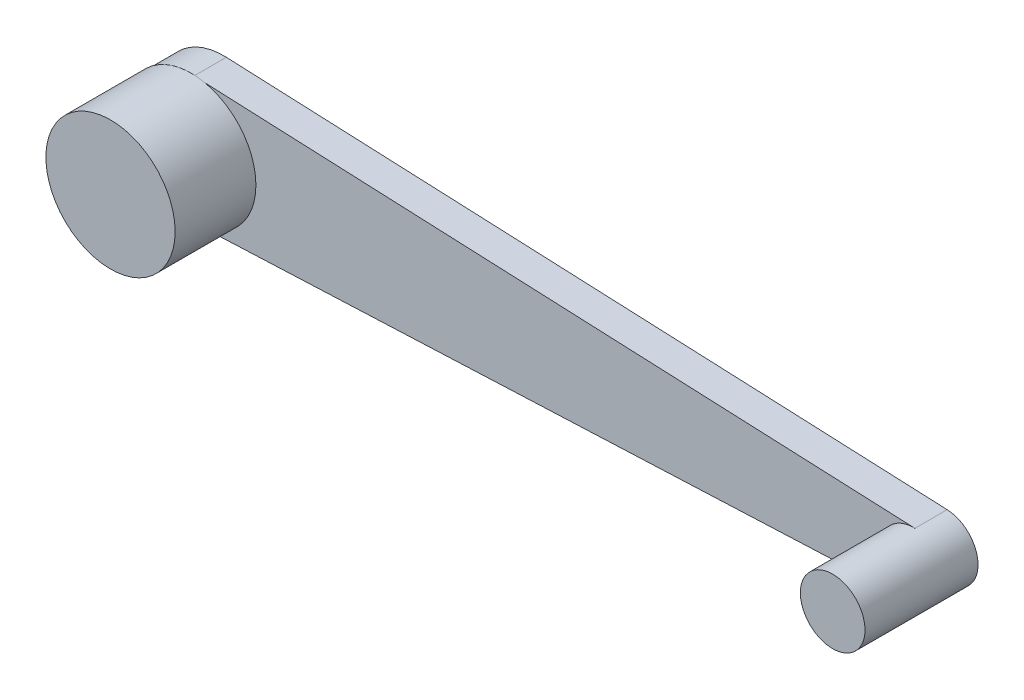
ISO-10303-21;
HEADER;
FILE_DESCRIPTION(('STEP AP214'),'2;1');
FILE_NAME('part.step','',(''),(''),'','','');
FILE_SCHEMA(('AUTOMOTIVE_DESIGN { 1 0 10303 214 1 1 1 1 }'));
ENDSEC;
DATA;
#1=APPLICATION_CONTEXT('core data for automotive mechanical design processes');
#2=APPLICATION_PROTOCOL_DEFINITION('international standard','automotive_design',2000,#1);
#3=PRODUCT_CONTEXT('',#1,'mechanical');
#4=PRODUCT('Part','Part','',(#3));
#5=PRODUCT_RELATED_PRODUCT_CATEGORY('part','',(#4));
#6=PRODUCT_DEFINITION_FORMATION('','',#4);
#7=PRODUCT_DEFINITION_CONTEXT('part definition',#1,'design');
#8=PRODUCT_DEFINITION('design','',#6,#7);
#9=PRODUCT_DEFINITION_SHAPE('','',#8);
#10=(LENGTH_UNIT() NAMED_UNIT(*) SI_UNIT(.MILLI.,.METRE.));
#11=(NAMED_UNIT(*) PLANE_ANGLE_UNIT() SI_UNIT($,.RADIAN.));
#12=(NAMED_UNIT(*) SI_UNIT($,.STERADIAN.) SOLID_ANGLE_UNIT());
#13=UNCERTAINTY_MEASURE_WITH_UNIT(LENGTH_MEASURE(1.E-05),#10,'distance_accuracy_value','');
#14=(GEOMETRIC_REPRESENTATION_CONTEXT(3) GLOBAL_UNCERTAINTY_ASSIGNED_CONTEXT((#13)) GLOBAL_UNIT_ASSIGNED_CONTEXT((#10,
#11,#12)) REPRESENTATION_CONTEXT('',''));
#15=CARTESIAN_POINT('',(0.,0.,0.));
#16=DIRECTION('',(0.,0.,1.));
#17=DIRECTION('',(1.,0.,0.));
#18=AXIS2_PLACEMENT_3D('',#15,#16,#17);
#19=CARTESIAN_POINT('',(0.,0.,2.));
#20=DIRECTION('',(0.,0.,1.));
#21=DIRECTION('',(1.,0.,0.));
#22=AXIS2_PLACEMENT_3D('',#19,#20,#21);
#23=PLANE('',#22);
#24=DIRECTION('',(0.999054373310961,0.0434782608695651,0.));
#25=VECTOR('',#24,1.);
#26=CARTESIAN_POINT('',(0.171455576559546,-3.93974920257844,2.));
#27=LINE('',#26,#25);
#28=CARTESIAN_POINT('',(0.840881057170086,-3.91061619795302,2.));
#29=VERTEX_POINT('',#28);
#30=CARTESIAN_POINT('',(44.7869565217391,-1.99810874662193,2.));
#31=VERTEX_POINT('',#30);
#32=EDGE_CURVE('E113',#29,#31,#27,.T.);
#33=ORIENTED_EDGE('',*,*,#32,.T.);
#34=CARTESIAN_POINT('',(44.7,0.,2.));
#35=DIRECTION('',(0.,0.,1.));
#36=DIRECTION('',(1.,0.,0.));
#37=AXIS2_PLACEMENT_3D('',#34,#35,#36);
#38=CIRCLE('',#37,2.);
#39=CARTESIAN_POINT('',(44.7869565217391,1.99810874662193,2.));
#40=VERTEX_POINT('',#39);
#41=EDGE_CURVE('E107',#40,#31,#38,.T.);
#42=ORIENTED_EDGE('',*,*,#41,.F.);
#43=DIRECTION('',(-0.999054373310961,0.0434782608695651,0.));
#44=VECTOR('',#43,1.);
#45=CARTESIAN_POINT('',(0.171455576559546,3.93974920257844,2.));
#46=LINE('',#45,#44);
#47=CARTESIAN_POINT('',(0.840881057170086,3.91061619795302,2.));
#48=VERTEX_POINT('',#47);
#49=EDGE_CURVE('E93',#40,#48,#46,.T.);
#50=ORIENTED_EDGE('',*,*,#49,.T.);
#51=CARTESIAN_POINT('',(0.,0.,2.));
#52=DIRECTION('',(0.,0.,1.));
#53=DIRECTION('',(1.,0.,0.));
#54=AXIS2_PLACEMENT_3D('',#51,#52,#53);
#55=CIRCLE('',#54,4.);
#56=EDGE_CURVE('E11',#29,#48,#55,.T.);
#57=ORIENTED_EDGE('',*,*,#56,.F.);
#58=EDGE_LOOP('',(#33,#42,#50,#57));
#59=FACE_BOUND('',#58,.T.);
#60=ADVANCED_FACE('F39',(#59),#23,.T.);
#61=CARTESIAN_POINT('',(0.,0.,2.));
#62=DIRECTION('',(0.,0.,-1.));
#63=DIRECTION('',(-1.,0.,0.));
#64=AXIS2_PLACEMENT_3D('',#61,#62,#63);
#65=CYLINDRICAL_SURFACE('',#64,3.94347826086956);
#66=CARTESIAN_POINT('',(0.,0.,0.));
#67=DIRECTION('',(0.,0.,1.));
#68=DIRECTION('',(1.,0.,0.));
#69=AXIS2_PLACEMENT_3D('',#66,#67,#68);
#70=CIRCLE('',#69,3.94347826086956);
#71=CARTESIAN_POINT('',(0.171455576559546,3.93974920257844,0.));
#72=VERTEX_POINT('',#71);
#73=CARTESIAN_POINT('',(0.171455576559546,-3.93974920257844,0.));
#74=VERTEX_POINT('',#73);
#75=EDGE_CURVE('E125',#72,#74,#70,.T.);
#76=ORIENTED_EDGE('',*,*,#75,.T.);
#77=DIRECTION('',(0.,0.,-1.));
#78=VECTOR('',#77,1.);
#79=CARTESIAN_POINT('',(0.171455576559546,-3.93974920257844,2.));
#80=LINE('',#79,#78);
#81=CARTESIAN_POINT('',(0.171455576559546,-3.93974920257844,2.));
#82=VERTEX_POINT('',#81);
#83=EDGE_CURVE('E43',#82,#74,#80,.T.);
#84=ORIENTED_EDGE('',*,*,#83,.F.);
#85=CARTESIAN_POINT('',(0.,0.,2.));
#86=DIRECTION('',(0.,0.,1.));
#87=DIRECTION('',(1.,0.,0.));
#88=AXIS2_PLACEMENT_3D('',#85,#86,#87);
#89=CIRCLE('',#88,3.94347826086956);
#90=CARTESIAN_POINT('',(0.171455576559546,3.93974920257844,2.));
#91=VERTEX_POINT('',#90);
#92=EDGE_CURVE('E129',#91,#82,#89,.T.);
#93=ORIENTED_EDGE('',*,*,#92,.F.);
#94=DIRECTION('',(0.,0.,-1.));
#95=VECTOR('',#94,1.);
#96=CARTESIAN_POINT('',(0.171455576559546,3.93974920257844,2.));
#97=LINE('',#96,#95);
#98=EDGE_CURVE('E64',#91,#72,#97,.T.);
#99=ORIENTED_EDGE('',*,*,#98,.T.);
#100=EDGE_LOOP('',(#76,#84,#93,#99));
#101=FACE_BOUND('',#100,.T.);
#102=ADVANCED_FACE('F41',(#101),#65,.T.);
#103=CARTESIAN_POINT('',(0.171455576559546,-3.93974920257844,2.));
#104=DIRECTION('',(-0.0434782608695651,0.999054373310962,0.));
#105=DIRECTION('',(-0.999054373310961,-0.0434782608695651,0.));
#106=AXIS2_PLACEMENT_3D('',#103,#104,#105);
#107=PLANE('',#106);
#108=DIRECTION('',(0.999054373310961,0.0434782608695651,0.));
#109=VECTOR('',#108,1.);
#110=CARTESIAN_POINT('',(0.171455576559546,-3.93974920257844,0.));
#111=LINE('',#110,#109);
#112=CARTESIAN_POINT('',(44.7869565217391,-1.99810874662193,0.));
#113=VERTEX_POINT('',#112);
#114=EDGE_CURVE('E138',#74,#113,#111,.T.);
#115=ORIENTED_EDGE('',*,*,#114,.T.);
#116=DIRECTION('',(0.,0.,-1.));
#117=VECTOR('',#116,1.);
#118=CARTESIAN_POINT('',(44.7869565217391,-1.99810874662193,2.));
#119=LINE('',#118,#117);
#120=EDGE_CURVE('E111',#31,#113,#119,.T.);
#121=ORIENTED_EDGE('',*,*,#120,.F.);
#122=ORIENTED_EDGE('',*,*,#32,.F.);
#123=EDGE_CURVE('E87',#82,#29,#27,.T.);
#124=ORIENTED_EDGE('',*,*,#123,.F.);
#125=ORIENTED_EDGE('',*,*,#83,.T.);
#126=EDGE_LOOP('',(#115,#121,#122,#124,#125));
#127=FACE_BOUND('',#126,.T.);
#128=ADVANCED_FACE('F148',(#127),#107,.F.);
#129=CARTESIAN_POINT('',(44.7,0.,2.));
#130=DIRECTION('',(0.,0.,-1.));
#131=DIRECTION('',(-1.,0.,0.));
#132=AXIS2_PLACEMENT_3D('',#129,#130,#131);
#133=CYLINDRICAL_SURFACE('',#132,2.);
#134=CARTESIAN_POINT('',(44.7,0.,0.));
#135=DIRECTION('',(0.,0.,1.));
#136=DIRECTION('',(-1.,0.,0.));
#137=AXIS2_PLACEMENT_3D('',#134,#135,#136);
#138=CIRCLE('',#137,2.);
#139=CARTESIAN_POINT('',(44.7869565217391,1.99810874662192,0.));
#140=VERTEX_POINT('',#139);
#141=EDGE_CURVE('E109',#113,#140,#138,.T.);
#142=ORIENTED_EDGE('',*,*,#141,.T.);
#143=DIRECTION('',(0.,0.,-1.));
#144=VECTOR('',#143,1.);
#145=CARTESIAN_POINT('',(44.7869565217391,1.99810874662192,2.));
#146=LINE('',#145,#144);
#147=EDGE_CURVE('E96',#40,#140,#146,.T.);
#148=ORIENTED_EDGE('',*,*,#147,.F.);
#149=ORIENTED_EDGE('',*,*,#41,.T.);
#150=ORIENTED_EDGE('',*,*,#120,.T.);
#151=EDGE_LOOP('',(#142,#148,#149,#150));
#152=FACE_BOUND('',#151,.T.);
#153=CARTESIAN_POINT('',(44.7,0.,7.));
#154=DIRECTION('',(0.,0.,1.));
#155=DIRECTION('',(1.,0.,0.));
#156=AXIS2_PLACEMENT_3D('',#153,#154,#155);
#157=CIRCLE('',#156,2.);
#158=CARTESIAN_POINT('',(46.7,0.,7.));
#159=VERTEX_POINT('',#158);
#160=EDGE_CURVE('E116',#159,#159,#157,.T.);
#161=ORIENTED_EDGE('',*,*,#160,.F.);
#162=EDGE_LOOP('',(#161));
#163=FACE_BOUND('',#162,.T.);
#164=ADVANCED_FACE('F104',(#152,#163),#133,.T.);
#165=CARTESIAN_POINT('',(0.171455576559546,3.93974920257844,2.));
#166=DIRECTION('',(-0.0434782608695652,-0.999054373310962,0.));
#167=DIRECTION('',(0.999054373310961,-0.0434782608695651,0.));
#168=AXIS2_PLACEMENT_3D('',#165,#166,#167);
#169=PLANE('',#168);
#170=DIRECTION('',(-0.999054373310961,0.0434782608695651,0.));
#171=VECTOR('',#170,1.);
#172=CARTESIAN_POINT('',(0.171455576559546,3.93974920257844,0.));
#173=LINE('',#172,#171);
#174=EDGE_CURVE('E82',#140,#72,#173,.T.);
#175=ORIENTED_EDGE('',*,*,#174,.T.);
#176=ORIENTED_EDGE('',*,*,#98,.F.);
#177=EDGE_CURVE('E98',#48,#91,#46,.T.);
#178=ORIENTED_EDGE('',*,*,#177,.F.);
#179=ORIENTED_EDGE('',*,*,#49,.F.);
#180=ORIENTED_EDGE('',*,*,#147,.T.);
#181=EDGE_LOOP('',(#175,#176,#178,#179,#180));
#182=FACE_BOUND('',#181,.T.);
#183=ADVANCED_FACE('F95',(#182),#169,.F.);
#184=CARTESIAN_POINT('',(0.,0.,0.));
#185=DIRECTION('',(0.,0.,1.));
#186=DIRECTION('',(1.,0.,0.));
#187=AXIS2_PLACEMENT_3D('',#184,#185,#186);
#188=PLANE('',#187);
#189=ORIENTED_EDGE('',*,*,#75,.F.);
#190=ORIENTED_EDGE('',*,*,#174,.F.);
#191=ORIENTED_EDGE('',*,*,#141,.F.);
#192=ORIENTED_EDGE('',*,*,#114,.F.);
#193=EDGE_LOOP('',(#189,#190,#191,#192));
#194=FACE_BOUND('',#193,.T.);
#195=ADVANCED_FACE('F152',(#194),#188,.F.);
#196=CARTESIAN_POINT('',(0.,0.,2.));
#197=DIRECTION('',(0.,0.,1.));
#198=DIRECTION('',(1.,0.,0.));
#199=AXIS2_PLACEMENT_3D('',#196,#197,#198);
#200=PLANE('',#199);
#201=ORIENTED_EDGE('',*,*,#92,.T.);
#202=ORIENTED_EDGE('',*,*,#123,.T.);
#203=EDGE_CURVE('E50',#48,#29,#55,.T.);
#204=ORIENTED_EDGE('',*,*,#203,.F.);
#205=ORIENTED_EDGE('',*,*,#177,.T.);
#206=EDGE_LOOP('',(#201,#202,#204,#205));
#207=FACE_BOUND('',#206,.T.);
#208=ADVANCED_FACE('F154',(#207),#200,.F.);
#209=CARTESIAN_POINT('',(0.,0.,7.));
#210=DIRECTION('',(0.,0.,-1.));
#211=DIRECTION('',(-1.,0.,0.));
#212=AXIS2_PLACEMENT_3D('',#209,#210,#211);
#213=CYLINDRICAL_SURFACE('',#212,4.);
#214=CARTESIAN_POINT('',(0.,0.,7.));
#215=DIRECTION('',(0.,0.,1.));
#216=DIRECTION('',(1.,0.,0.));
#217=AXIS2_PLACEMENT_3D('',#214,#215,#216);
#218=CIRCLE('',#217,4.);
#219=CARTESIAN_POINT('',(4.,0.,7.));
#220=VERTEX_POINT('',#219);
#221=EDGE_CURVE('E122',#220,#220,#218,.T.);
#222=ORIENTED_EDGE('',*,*,#221,.F.);
#223=EDGE_LOOP('',(#222));
#224=FACE_BOUND('',#223,.T.);
#225=ORIENTED_EDGE('',*,*,#203,.T.);
#226=ORIENTED_EDGE('',*,*,#56,.T.);
#227=EDGE_LOOP('',(#225,#226));
#228=FACE_BOUND('',#227,.T.);
#229=ADVANCED_FACE('F160',(#224,#228),#213,.T.);
#230=CARTESIAN_POINT('',(0.,0.,7.));
#231=DIRECTION('',(0.,0.,1.));
#232=DIRECTION('',(1.,0.,0.));
#233=AXIS2_PLACEMENT_3D('',#230,#231,#232);
#234=PLANE('',#233);
#235=ORIENTED_EDGE('',*,*,#221,.T.);
#236=EDGE_LOOP('',(#235));
#237=FACE_BOUND('',#236,.T.);
#238=ADVANCED_FACE('F171',(#237),#234,.T.);
#239=CARTESIAN_POINT('',(44.7,0.,7.));
#240=DIRECTION('',(0.,0.,1.));
#241=DIRECTION('',(1.,0.,0.));
#242=AXIS2_PLACEMENT_3D('',#239,#240,#241);
#243=PLANE('',#242);
#244=ORIENTED_EDGE('',*,*,#160,.T.);
#245=EDGE_LOOP('',(#244));
#246=FACE_BOUND('',#245,.T.);
#247=ADVANCED_FACE('F176',(#246),#243,.T.);
#248=CLOSED_SHELL('',(#60,#102,#128,#164,#183,#195,#208,#229,#238,#247));
#249=MANIFOLD_SOLID_BREP('B2',#248);
#250=ADVANCED_BREP_SHAPE_REPRESENTATION('',(#18,#249),#14);
#251=SHAPE_DEFINITION_REPRESENTATION(#9,#250);
ENDSEC;
END-ISO-10303-21;
